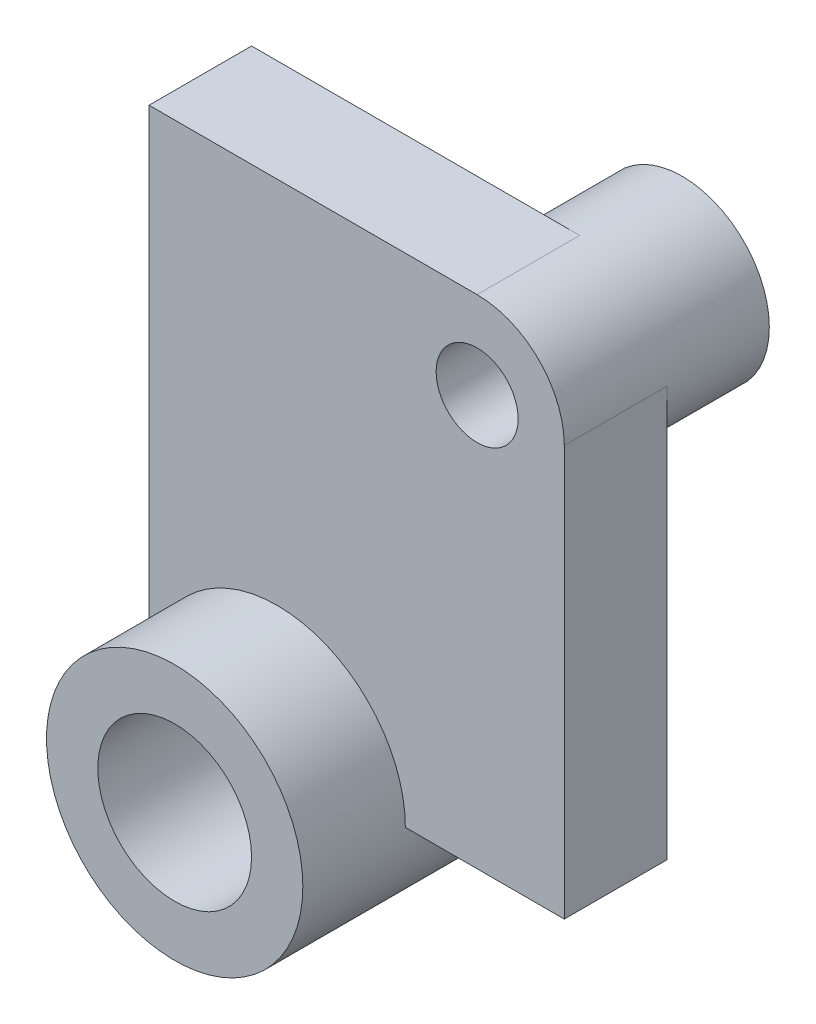
ISO-10303-21;
HEADER;
FILE_DESCRIPTION(('STEP AP214'),'2;1');
FILE_NAME('part.step','',(''),(''),'','','');
FILE_SCHEMA(('AUTOMOTIVE_DESIGN { 1 0 10303 214 1 1 1 1 }'));
ENDSEC;
DATA;
#1=APPLICATION_CONTEXT('core data for automotive mechanical design processes');
#2=APPLICATION_PROTOCOL_DEFINITION('international standard','automotive_design',2000,#1);
#3=PRODUCT_CONTEXT('',#1,'mechanical');
#4=PRODUCT('Part','Part','',(#3));
#5=PRODUCT_RELATED_PRODUCT_CATEGORY('part','',(#4));
#6=PRODUCT_DEFINITION_FORMATION('','',#4);
#7=PRODUCT_DEFINITION_CONTEXT('part definition',#1,'design');
#8=PRODUCT_DEFINITION('design','',#6,#7);
#9=PRODUCT_DEFINITION_SHAPE('','',#8);
#10=(LENGTH_UNIT() NAMED_UNIT(*) SI_UNIT(.MILLI.,.METRE.));
#11=(NAMED_UNIT(*) PLANE_ANGLE_UNIT() SI_UNIT($,.RADIAN.));
#12=(NAMED_UNIT(*) SI_UNIT($,.STERADIAN.) SOLID_ANGLE_UNIT());
#13=UNCERTAINTY_MEASURE_WITH_UNIT(LENGTH_MEASURE(1.E-05),#10,'distance_accuracy_value','');
#14=(GEOMETRIC_REPRESENTATION_CONTEXT(3) GLOBAL_UNCERTAINTY_ASSIGNED_CONTEXT((#13)) GLOBAL_UNIT_ASSIGNED_CONTEXT((#10,
#11,#12)) REPRESENTATION_CONTEXT('',''));
#15=CARTESIAN_POINT('',(0.,0.,0.));
#16=DIRECTION('',(0.,0.,1.));
#17=DIRECTION('',(1.,0.,0.));
#18=AXIS2_PLACEMENT_3D('',#15,#16,#17);
#19=CARTESIAN_POINT('',(0.,0.,0.));
#20=DIRECTION('',(0.,0.,1.));
#21=DIRECTION('',(1.,0.,0.));
#22=AXIS2_PLACEMENT_3D('',#19,#20,#21);
#23=PLANE('',#22);
#24=CARTESIAN_POINT('',(-19.5,-40.,0.));
#25=DIRECTION('',(0.,0.,1.));
#26=DIRECTION('',(1.,0.,0.));
#27=AXIS2_PLACEMENT_3D('',#24,#25,#26);
#28=CIRCLE('',#27,7.5);
#29=CARTESIAN_POINT('',(-12.,-40.,0.));
#30=VERTEX_POINT('',#29);
#31=EDGE_CURVE('E176',#30,#30,#28,.F.);
#32=ORIENTED_EDGE('',*,*,#31,.F.);
#33=EDGE_LOOP('',(#32));
#34=FACE_BOUND('',#33,.T.);
#35=DIRECTION('',(0.,-1.,0.));
#36=VECTOR('',#35,1.);
#37=CARTESIAN_POINT('',(8.5,0.,0.));
#38=LINE('',#37,#36);
#39=CARTESIAN_POINT('',(8.5,0.,0.));
#40=VERTEX_POINT('',#39);
#41=CARTESIAN_POINT('',(8.5,-40.,0.));
#42=VERTEX_POINT('',#41);
#43=EDGE_CURVE('E135',#40,#42,#38,.T.);
#44=ORIENTED_EDGE('',*,*,#43,.T.);
#45=DIRECTION('',(-1.,0.,0.));
#46=VECTOR('',#45,1.);
#47=CARTESIAN_POINT('',(0.,-40.,0.));
#48=LINE('',#47,#46);
#49=CARTESIAN_POINT('',(-7.,-40.,0.));
#50=VERTEX_POINT('',#49);
#51=EDGE_CURVE('E161',#42,#50,#48,.T.);
#52=ORIENTED_EDGE('',*,*,#51,.T.);
#53=CARTESIAN_POINT('',(-19.5,-40.,0.));
#54=DIRECTION('',(0.,0.,1.));
#55=DIRECTION('',(1.,0.,0.));
#56=AXIS2_PLACEMENT_3D('',#53,#54,#55);
#57=CIRCLE('',#56,12.5);
#58=CARTESIAN_POINT('',(-32.,-40.,0.));
#59=VERTEX_POINT('',#58);
#60=EDGE_CURVE('E90',#50,#59,#57,.F.);
#61=ORIENTED_EDGE('',*,*,#60,.T.);
#62=DIRECTION('',(0.,1.,0.));
#63=VECTOR('',#62,1.);
#64=CARTESIAN_POINT('',(-32.,0.,0.));
#65=LINE('',#64,#63);
#66=CARTESIAN_POINT('',(-32.,8.5,0.));
#67=VERTEX_POINT('',#66);
#68=EDGE_CURVE('E172',#59,#67,#65,.T.);
#69=ORIENTED_EDGE('',*,*,#68,.T.);
#70=DIRECTION('',(-1.,0.,0.));
#71=VECTOR('',#70,1.);
#72=CARTESIAN_POINT('',(0.,8.5,0.));
#73=LINE('',#72,#71);
#74=CARTESIAN_POINT('',(0.,8.5,0.));
#75=VERTEX_POINT('',#74);
#76=EDGE_CURVE('E144',#75,#67,#73,.T.);
#77=ORIENTED_EDGE('',*,*,#76,.F.);
#78=CARTESIAN_POINT('',(0.,0.,0.));
#79=DIRECTION('',(0.,0.,-1.));
#80=DIRECTION('',(-1.,0.,0.));
#81=AXIS2_PLACEMENT_3D('',#78,#79,#80);
#82=CIRCLE('',#81,8.5);
#83=EDGE_CURVE('E77',#40,#75,#82,.T.);
#84=ORIENTED_EDGE('',*,*,#83,.F.);
#85=EDGE_LOOP('',(#44,#52,#61,#69,#77,#84));
#86=FACE_BOUND('',#85,.T.);
#87=ADVANCED_FACE('F73',(#34,#86),#23,.F.);
#88=CARTESIAN_POINT('',(0.,-40.,10.));
#89=DIRECTION('',(0.,-1.,0.));
#90=DIRECTION('',(0.,0.,-1.));
#91=AXIS2_PLACEMENT_3D('',#88,#89,#90);
#92=PLANE('',#91);
#93=ORIENTED_EDGE('',*,*,#51,.F.);
#94=DIRECTION('',(0.,0.,-1.));
#95=VECTOR('',#94,1.);
#96=CARTESIAN_POINT('',(8.5,-40.,20.));
#97=LINE('',#96,#95);
#98=CARTESIAN_POINT('',(8.5,-40.,10.));
#99=VERTEX_POINT('',#98);
#100=EDGE_CURVE('E134',#99,#42,#97,.T.);
#101=ORIENTED_EDGE('',*,*,#100,.F.);
#102=DIRECTION('',(-1.,0.,0.));
#103=VECTOR('',#102,1.);
#104=CARTESIAN_POINT('',(0.,-40.,10.));
#105=LINE('',#104,#103);
#106=CARTESIAN_POINT('',(-7.,-40.,10.));
#107=VERTEX_POINT('',#106);
#108=EDGE_CURVE('E151',#99,#107,#105,.T.);
#109=ORIENTED_EDGE('',*,*,#108,.T.);
#110=DIRECTION('',(0.,0.,1.));
#111=VECTOR('',#110,1.);
#112=CARTESIAN_POINT('',(-7.,-40.,-35.3553390593274));
#113=LINE('',#112,#111);
#114=EDGE_CURVE('E170',#50,#107,#113,.T.);
#115=ORIENTED_EDGE('',*,*,#114,.F.);
#116=EDGE_LOOP('',(#93,#101,#109,#115));
#117=FACE_BOUND('',#116,.T.);
#118=ADVANCED_FACE('F185',(#117),#92,.T.);
#119=CARTESIAN_POINT('',(0.,0.,10.));
#120=DIRECTION('',(0.,0.,1.));
#121=DIRECTION('',(1.,0.,0.));
#122=AXIS2_PLACEMENT_3D('',#119,#120,#121);
#123=PLANE('',#122);
#124=CARTESIAN_POINT('',(0.,0.,10.));
#125=DIRECTION('',(0.,0.,1.));
#126=DIRECTION('',(1.,0.,0.));
#127=AXIS2_PLACEMENT_3D('',#124,#125,#126);
#128=CIRCLE('',#127,4.);
#129=CARTESIAN_POINT('',(4.,0.,10.));
#130=VERTEX_POINT('',#129);
#131=EDGE_CURVE('E146',#130,#130,#128,.T.);
#132=ORIENTED_EDGE('',*,*,#131,.F.);
#133=EDGE_LOOP('',(#132));
#134=FACE_BOUND('',#133,.T.);
#135=ORIENTED_EDGE('',*,*,#108,.F.);
#136=DIRECTION('',(0.,1.,0.));
#137=VECTOR('',#136,1.);
#138=CARTESIAN_POINT('',(8.5,0.,10.));
#139=LINE('',#138,#137);
#140=CARTESIAN_POINT('',(8.5,0.,10.));
#141=VERTEX_POINT('',#140);
#142=EDGE_CURVE('E14',#99,#141,#139,.T.);
#143=ORIENTED_EDGE('',*,*,#142,.T.);
#144=CARTESIAN_POINT('',(0.,0.,10.));
#145=DIRECTION('',(0.,0.,1.));
#146=DIRECTION('',(1.,0.,0.));
#147=AXIS2_PLACEMENT_3D('',#144,#145,#146);
#148=CIRCLE('',#147,8.5);
#149=CARTESIAN_POINT('',(0.,8.5,10.));
#150=VERTEX_POINT('',#149);
#151=EDGE_CURVE('E132',#150,#141,#148,.F.);
#152=ORIENTED_EDGE('',*,*,#151,.F.);
#153=DIRECTION('',(1.,0.,0.));
#154=VECTOR('',#153,1.);
#155=CARTESIAN_POINT('',(0.,8.5,10.));
#156=LINE('',#155,#154);
#157=CARTESIAN_POINT('',(-32.,8.5,10.));
#158=VERTEX_POINT('',#157);
#159=EDGE_CURVE('E206',#158,#150,#156,.T.);
#160=ORIENTED_EDGE('',*,*,#159,.F.);
#161=DIRECTION('',(0.,1.,0.));
#162=VECTOR('',#161,1.);
#163=CARTESIAN_POINT('',(-32.,0.,10.));
#164=LINE('',#163,#162);
#165=CARTESIAN_POINT('',(-32.,-40.,10.));
#166=VERTEX_POINT('',#165);
#167=EDGE_CURVE('E159',#166,#158,#164,.T.);
#168=ORIENTED_EDGE('',*,*,#167,.F.);
#169=CARTESIAN_POINT('',(-19.5,-40.,10.));
#170=DIRECTION('',(0.,0.,1.));
#171=DIRECTION('',(1.,0.,0.));
#172=AXIS2_PLACEMENT_3D('',#169,#170,#171);
#173=CIRCLE('',#172,12.5);
#174=EDGE_CURVE('E189',#107,#166,#173,.T.);
#175=ORIENTED_EDGE('',*,*,#174,.F.);
#176=EDGE_LOOP('',(#135,#143,#152,#160,#168,#175));
#177=FACE_BOUND('',#176,.T.);
#178=ADVANCED_FACE('F188',(#134,#177),#123,.T.);
#179=CARTESIAN_POINT('',(0.,8.5,-39.7020150622106));
#180=DIRECTION('',(0.,-1.,0.));
#181=DIRECTION('',(0.,0.,-1.));
#182=AXIS2_PLACEMENT_3D('',#179,#180,#181);
#183=PLANE('',#182);
#184=DIRECTION('',(0.,0.,-1.));
#185=VECTOR('',#184,1.);
#186=CARTESIAN_POINT('',(0.,8.5,20.));
#187=LINE('',#186,#185);
#188=EDGE_CURVE('E83',#75,#150,#187,.F.);
#189=ORIENTED_EDGE('',*,*,#188,.F.);
#190=ORIENTED_EDGE('',*,*,#76,.T.);
#191=DIRECTION('',(0.,0.,1.));
#192=VECTOR('',#191,1.);
#193=CARTESIAN_POINT('',(-32.,8.5,-39.7020150622106));
#194=LINE('',#193,#192);
#195=EDGE_CURVE('E203',#67,#158,#194,.T.);
#196=ORIENTED_EDGE('',*,*,#195,.T.);
#197=ORIENTED_EDGE('',*,*,#159,.T.);
#198=EDGE_LOOP('',(#189,#190,#196,#197));
#199=FACE_BOUND('',#198,.T.);
#200=ADVANCED_FACE('F213',(#199),#183,.F.);
#201=CARTESIAN_POINT('',(0.,0.,10.));
#202=DIRECTION('',(0.,0.,-1.));
#203=DIRECTION('',(-1.,0.,0.));
#204=AXIS2_PLACEMENT_3D('',#201,#202,#203);
#205=CYLINDRICAL_SURFACE('',#204,8.5);
#206=CARTESIAN_POINT('',(0.,0.,-10.));
#207=DIRECTION('',(0.,0.,-1.));
#208=DIRECTION('',(-1.,0.,0.));
#209=AXIS2_PLACEMENT_3D('',#206,#207,#208);
#210=CIRCLE('',#209,8.5);
#211=CARTESIAN_POINT('',(-8.5,0.,-10.));
#212=VERTEX_POINT('',#211);
#213=EDGE_CURVE('E195',#212,#212,#210,.T.);
#214=ORIENTED_EDGE('',*,*,#213,.F.);
#215=EDGE_LOOP('',(#214));
#216=FACE_BOUND('',#215,.T.);
#217=ORIENTED_EDGE('',*,*,#83,.T.);
#218=ORIENTED_EDGE('',*,*,#188,.T.);
#219=ORIENTED_EDGE('',*,*,#151,.T.);
#220=DIRECTION('',(0.,0.,-1.));
#221=VECTOR('',#220,1.);
#222=CARTESIAN_POINT('',(8.5,0.,20.));
#223=LINE('',#222,#221);
#224=EDGE_CURVE('E127',#141,#40,#223,.T.);
#225=ORIENTED_EDGE('',*,*,#224,.T.);
#226=EDGE_LOOP('',(#217,#218,#219,#225));
#227=FACE_BOUND('',#226,.T.);
#228=ADVANCED_FACE('F75',(#216,#227),#205,.T.);
#229=CARTESIAN_POINT('',(-32.,0.,10.));
#230=DIRECTION('',(-1.,0.,0.));
#231=DIRECTION('',(0.,0.,1.));
#232=AXIS2_PLACEMENT_3D('',#229,#230,#231);
#233=PLANE('',#232);
#234=ORIENTED_EDGE('',*,*,#68,.F.);
#235=DIRECTION('',(0.,0.,-1.));
#236=VECTOR('',#235,1.);
#237=CARTESIAN_POINT('',(-32.,-40.,10.));
#238=LINE('',#237,#236);
#239=EDGE_CURVE('E97',#166,#59,#238,.T.);
#240=ORIENTED_EDGE('',*,*,#239,.F.);
#241=ORIENTED_EDGE('',*,*,#167,.T.);
#242=ORIENTED_EDGE('',*,*,#195,.F.);
#243=EDGE_LOOP('',(#234,#240,#241,#242));
#244=FACE_BOUND('',#243,.T.);
#245=ADVANCED_FACE('F214',(#244),#233,.T.);
#246=CARTESIAN_POINT('',(0.,0.,10.));
#247=DIRECTION('',(0.,0.,-1.));
#248=DIRECTION('',(-1.,0.,0.));
#249=AXIS2_PLACEMENT_3D('',#246,#247,#248);
#250=CYLINDRICAL_SURFACE('',#249,4.);
#251=ORIENTED_EDGE('',*,*,#131,.T.);
#252=EDGE_LOOP('',(#251));
#253=FACE_BOUND('',#252,.T.);
#254=CARTESIAN_POINT('',(0.,0.,-10.));
#255=DIRECTION('',(0.,0.,-1.));
#256=DIRECTION('',(-1.,0.,0.));
#257=AXIS2_PLACEMENT_3D('',#254,#255,#256);
#258=CIRCLE('',#257,4.);
#259=CARTESIAN_POINT('',(-4.,0.,-10.));
#260=VERTEX_POINT('',#259);
#261=EDGE_CURVE('E200',#260,#260,#258,.T.);
#262=ORIENTED_EDGE('',*,*,#261,.T.);
#263=EDGE_LOOP('',(#262));
#264=FACE_BOUND('',#263,.T.);
#265=ADVANCED_FACE('F216',(#253,#264),#250,.F.);
#266=CARTESIAN_POINT('',(-19.5,-40.,-35.3553390593274));
#267=DIRECTION('',(0.,0.,1.));
#268=DIRECTION('',(1.,0.,0.));
#269=AXIS2_PLACEMENT_3D('',#266,#267,#268);
#270=CYLINDRICAL_SURFACE('',#269,12.5);
#271=ORIENTED_EDGE('',*,*,#60,.F.);
#272=ORIENTED_EDGE('',*,*,#114,.T.);
#273=ORIENTED_EDGE('',*,*,#174,.T.);
#274=ORIENTED_EDGE('',*,*,#239,.T.);
#275=EDGE_LOOP('',(#271,#272,#273,#274));
#276=FACE_BOUND('',#275,.T.);
#277=CARTESIAN_POINT('',(-19.5,-40.,20.));
#278=DIRECTION('',(0.,0.,1.));
#279=DIRECTION('',(1.,0.,0.));
#280=AXIS2_PLACEMENT_3D('',#277,#278,#279);
#281=CIRCLE('',#280,12.5);
#282=CARTESIAN_POINT('',(-7.,-40.,20.));
#283=VERTEX_POINT('',#282);
#284=EDGE_CURVE('E179',#283,#283,#281,.T.);
#285=ORIENTED_EDGE('',*,*,#284,.F.);
#286=EDGE_LOOP('',(#285));
#287=FACE_BOUND('',#286,.T.);
#288=ADVANCED_FACE('F183',(#276,#287),#270,.T.);
#289=CARTESIAN_POINT('',(-19.5,-40.,-0.000999999999999265));
#290=DIRECTION('',(0.,0.,1.));
#291=DIRECTION('',(1.,0.,0.));
#292=AXIS2_PLACEMENT_3D('',#289,#290,#291);
#293=CYLINDRICAL_SURFACE('',#292,7.5);
#294=ORIENTED_EDGE('',*,*,#31,.T.);
#295=EDGE_LOOP('',(#294));
#296=FACE_BOUND('',#295,.T.);
#297=CARTESIAN_POINT('',(-19.5,-40.,20.));
#298=DIRECTION('',(0.,0.,1.));
#299=DIRECTION('',(1.,0.,0.));
#300=AXIS2_PLACEMENT_3D('',#297,#298,#299);
#301=CIRCLE('',#300,7.5);
#302=CARTESIAN_POINT('',(-12.,-40.,20.));
#303=VERTEX_POINT('',#302);
#304=EDGE_CURVE('E191',#303,#303,#301,.T.);
#305=ORIENTED_EDGE('',*,*,#304,.T.);
#306=EDGE_LOOP('',(#305));
#307=FACE_BOUND('',#306,.T.);
#308=ADVANCED_FACE('F238',(#296,#307),#293,.F.);
#309=CARTESIAN_POINT('',(-19.5,-40.,20.));
#310=DIRECTION('',(0.,0.,1.));
#311=DIRECTION('',(1.,0.,0.));
#312=AXIS2_PLACEMENT_3D('',#309,#310,#311);
#313=PLANE('',#312);
#314=ORIENTED_EDGE('',*,*,#284,.T.);
#315=EDGE_LOOP('',(#314));
#316=FACE_BOUND('',#315,.T.);
#317=ORIENTED_EDGE('',*,*,#304,.F.);
#318=EDGE_LOOP('',(#317));
#319=FACE_BOUND('',#318,.T.);
#320=ADVANCED_FACE('F241',(#316,#319),#313,.T.);
#321=CARTESIAN_POINT('',(0.,0.,-10.));
#322=DIRECTION('',(0.,0.,-1.));
#323=DIRECTION('',(-1.,0.,0.));
#324=AXIS2_PLACEMENT_3D('',#321,#322,#323);
#325=PLANE('',#324);
#326=ORIENTED_EDGE('',*,*,#213,.T.);
#327=EDGE_LOOP('',(#326));
#328=FACE_BOUND('',#327,.T.);
#329=ORIENTED_EDGE('',*,*,#261,.F.);
#330=EDGE_LOOP('',(#329));
#331=FACE_BOUND('',#330,.T.);
#332=ADVANCED_FACE('F245',(#328,#331),#325,.T.);
#333=CARTESIAN_POINT('',(8.5,0.,20.));
#334=DIRECTION('',(1.,0.,0.));
#335=DIRECTION('',(0.,0.,-1.));
#336=AXIS2_PLACEMENT_3D('',#333,#334,#335);
#337=PLANE('',#336);
#338=ORIENTED_EDGE('',*,*,#100,.T.);
#339=ORIENTED_EDGE('',*,*,#43,.F.);
#340=ORIENTED_EDGE('',*,*,#224,.F.);
#341=ORIENTED_EDGE('',*,*,#142,.F.);
#342=EDGE_LOOP('',(#338,#339,#340,#341));
#343=FACE_BOUND('',#342,.T.);
#344=ADVANCED_FACE('F138',(#343),#337,.T.);
#345=CLOSED_SHELL('',(#87,#118,#178,#200,#228,#245,#265,#288,#308,#320,#332,#344));
#346=MANIFOLD_SOLID_BREP('B2',#345);
#347=ADVANCED_BREP_SHAPE_REPRESENTATION('',(#18,#346),#14);
#348=SHAPE_DEFINITION_REPRESENTATION(#9,#347);
ENDSEC;
END-ISO-10303-21;
